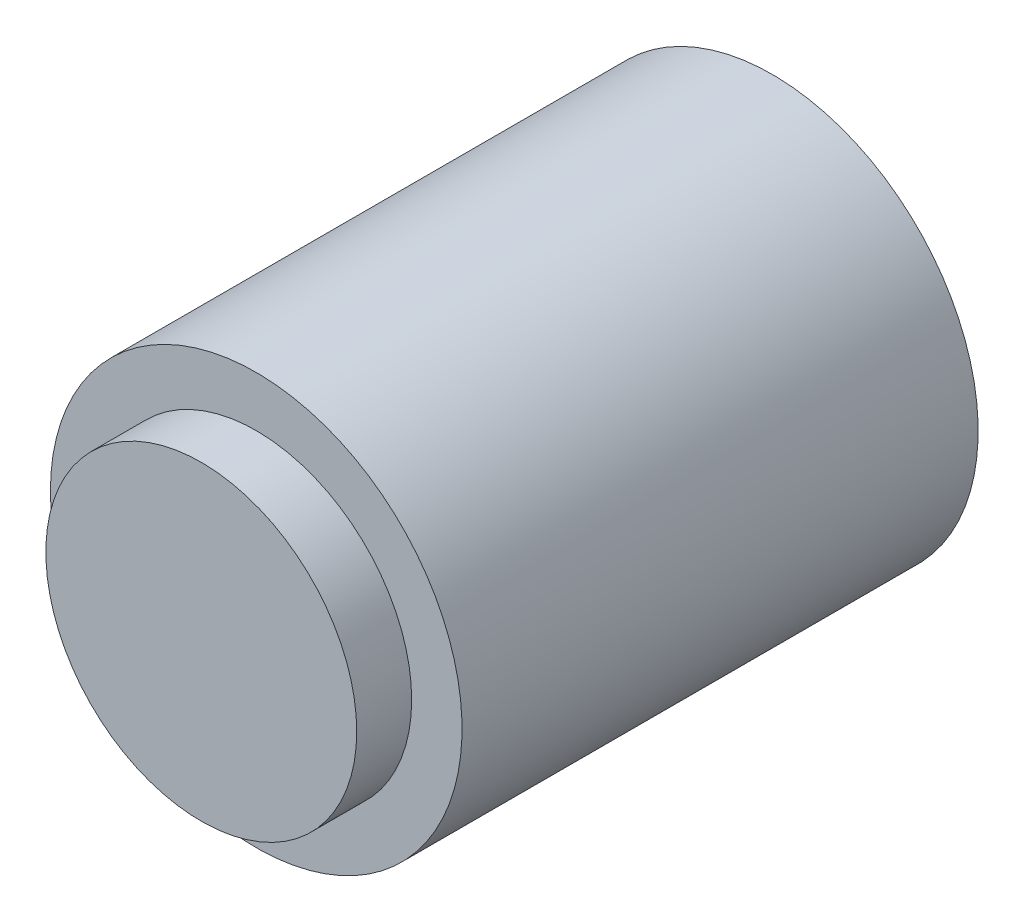
ISO-10303-21;
HEADER;
FILE_DESCRIPTION(('STEP AP214'),'2;1');
FILE_NAME('part.step','',(''),(''),'','','');
FILE_SCHEMA(('AUTOMOTIVE_DESIGN { 1 0 10303 214 1 1 1 1 }'));
ENDSEC;
DATA;
#1=APPLICATION_CONTEXT('core data for automotive mechanical design processes');
#2=APPLICATION_PROTOCOL_DEFINITION('international standard','automotive_design',2000,#1);
#3=PRODUCT_CONTEXT('',#1,'mechanical');
#4=PRODUCT('Part','Part','',(#3));
#5=PRODUCT_RELATED_PRODUCT_CATEGORY('part','',(#4));
#6=PRODUCT_DEFINITION_FORMATION('','',#4);
#7=PRODUCT_DEFINITION_CONTEXT('part definition',#1,'design');
#8=PRODUCT_DEFINITION('design','',#6,#7);
#9=PRODUCT_DEFINITION_SHAPE('','',#8);
#10=(LENGTH_UNIT() NAMED_UNIT(*) SI_UNIT(.MILLI.,.METRE.));
#11=(NAMED_UNIT(*) PLANE_ANGLE_UNIT() SI_UNIT($,.RADIAN.));
#12=(NAMED_UNIT(*) SI_UNIT($,.STERADIAN.) SOLID_ANGLE_UNIT());
#13=UNCERTAINTY_MEASURE_WITH_UNIT(LENGTH_MEASURE(1.E-05),#10,'distance_accuracy_value','');
#14=(GEOMETRIC_REPRESENTATION_CONTEXT(3) GLOBAL_UNCERTAINTY_ASSIGNED_CONTEXT((#13)) GLOBAL_UNIT_ASSIGNED_CONTEXT((#10,
#11,#12)) REPRESENTATION_CONTEXT('',''));
#15=CARTESIAN_POINT('',(0.,0.,0.));
#16=DIRECTION('',(0.,0.,1.));
#17=DIRECTION('',(1.,0.,0.));
#18=AXIS2_PLACEMENT_3D('',#15,#16,#17);
#19=CARTESIAN_POINT('',(0.,0.,42.));
#20=DIRECTION('',(0.,0.,-1.));
#21=DIRECTION('',(-1.,0.,0.));
#22=AXIS2_PLACEMENT_3D('',#19,#20,#21);
#23=CYLINDRICAL_SURFACE('',#22,16.75);
#24=CARTESIAN_POINT('',(0.,0.,42.));
#25=DIRECTION('',(0.,0.,1.));
#26=DIRECTION('',(1.,0.,0.));
#27=AXIS2_PLACEMENT_3D('',#24,#25,#26);
#28=CIRCLE('',#27,16.75);
#29=CARTESIAN_POINT('',(-16.75,0.,42.));
#30=VERTEX_POINT('',#29);
#31=EDGE_CURVE('E45',#30,#30,#28,.T.);
#32=CARTESIAN_POINT('',(0.,0.,0.));
#33=DIRECTION('',(0.,0.,1.));
#34=DIRECTION('',(1.,0.,0.));
#35=AXIS2_PLACEMENT_3D('',#32,#33,#34);
#36=CIRCLE('',#35,16.75);
#37=CARTESIAN_POINT('',(-16.75,0.,0.));
#38=VERTEX_POINT('',#37);
#39=EDGE_CURVE('E40',#38,#38,#36,.T.);
#40=CARTESIAN_POINT('',(-16.75,0.,42.));
#41=CARTESIAN_POINT('',(-16.75,0.,41.5625));
#42=CARTESIAN_POINT('',(-16.75,0.,41.125));
#43=CARTESIAN_POINT('',(-16.75,0.,40.25));
#44=CARTESIAN_POINT('',(-16.75,0.,39.8125));
#45=CARTESIAN_POINT('',(-16.75,0.,38.9375));
#46=CARTESIAN_POINT('',(-16.75,0.,38.5));
#47=CARTESIAN_POINT('',(-16.75,0.,37.625));
#48=CARTESIAN_POINT('',(-16.75,0.,37.1875));
#49=CARTESIAN_POINT('',(-16.75,0.,36.3125));
#50=CARTESIAN_POINT('',(-16.75,0.,35.875));
#51=CARTESIAN_POINT('',(-16.75,0.,35.));
#52=CARTESIAN_POINT('',(-16.75,0.,34.5625));
#53=CARTESIAN_POINT('',(-16.75,0.,33.6875));
#54=CARTESIAN_POINT('',(-16.75,0.,33.25));
#55=CARTESIAN_POINT('',(-16.75,0.,32.375));
#56=CARTESIAN_POINT('',(-16.75,0.,31.9375));
#57=CARTESIAN_POINT('',(-16.75,0.,31.0625));
#58=CARTESIAN_POINT('',(-16.75,0.,30.625));
#59=CARTESIAN_POINT('',(-16.75,0.,29.75));
#60=CARTESIAN_POINT('',(-16.75,0.,29.3125));
#61=CARTESIAN_POINT('',(-16.75,0.,28.4375));
#62=CARTESIAN_POINT('',(-16.75,0.,28.));
#63=CARTESIAN_POINT('',(-16.75,0.,27.125));
#64=CARTESIAN_POINT('',(-16.75,0.,26.6875));
#65=CARTESIAN_POINT('',(-16.75,0.,25.8125));
#66=CARTESIAN_POINT('',(-16.75,0.,25.375));
#67=CARTESIAN_POINT('',(-16.75,0.,24.5));
#68=CARTESIAN_POINT('',(-16.75,0.,24.0625));
#69=CARTESIAN_POINT('',(-16.75,0.,23.1875));
#70=CARTESIAN_POINT('',(-16.75,0.,22.75));
#71=CARTESIAN_POINT('',(-16.75,0.,21.875));
#72=CARTESIAN_POINT('',(-16.75,0.,21.4375));
#73=CARTESIAN_POINT('',(-16.75,0.,20.5625));
#74=CARTESIAN_POINT('',(-16.75,0.,20.125));
#75=CARTESIAN_POINT('',(-16.75,0.,19.25));
#76=CARTESIAN_POINT('',(-16.75,0.,18.8125));
#77=CARTESIAN_POINT('',(-16.75,0.,17.9375));
#78=CARTESIAN_POINT('',(-16.75,0.,17.5));
#79=CARTESIAN_POINT('',(-16.75,0.,16.625));
#80=CARTESIAN_POINT('',(-16.75,0.,16.1875));
#81=CARTESIAN_POINT('',(-16.75,0.,15.3125));
#82=CARTESIAN_POINT('',(-16.75,0.,14.875));
#83=CARTESIAN_POINT('',(-16.75,0.,14.));
#84=CARTESIAN_POINT('',(-16.75,0.,13.5625));
#85=CARTESIAN_POINT('',(-16.75,0.,12.6875));
#86=CARTESIAN_POINT('',(-16.75,0.,12.25));
#87=CARTESIAN_POINT('',(-16.75,0.,11.375));
#88=CARTESIAN_POINT('',(-16.75,0.,10.9375));
#89=CARTESIAN_POINT('',(-16.75,0.,10.0625));
#90=CARTESIAN_POINT('',(-16.75,0.,9.625));
#91=CARTESIAN_POINT('',(-16.75,0.,8.75));
#92=CARTESIAN_POINT('',(-16.75,0.,8.3125));
#93=CARTESIAN_POINT('',(-16.75,0.,7.4375));
#94=CARTESIAN_POINT('',(-16.75,0.,7.));
#95=CARTESIAN_POINT('',(-16.75,0.,6.125));
#96=CARTESIAN_POINT('',(-16.75,0.,5.6875));
#97=CARTESIAN_POINT('',(-16.75,0.,4.8125));
#98=CARTESIAN_POINT('',(-16.75,0.,4.375));
#99=CARTESIAN_POINT('',(-16.75,0.,3.5));
#100=CARTESIAN_POINT('',(-16.75,0.,3.0625));
#101=CARTESIAN_POINT('',(-16.75,0.,2.1875));
#102=CARTESIAN_POINT('',(-16.75,0.,1.75));
#103=CARTESIAN_POINT('',(-16.75,0.,0.875000000000001));
#104=CARTESIAN_POINT('',(-16.75,0.,0.4375));
#105=CARTESIAN_POINT('',(-16.75,0.,0.));
#106=B_SPLINE_CURVE_WITH_KNOTS('',3,(#40,#41,#42,#43,#44,#45,#46,#47,#48,#49,#50,#51,#52,#53,
#54,#55,#56,#57,#58,#59,#60,#61,#62,#63,#64,#65,#66,#67,#68,#69,#70,#71,#72,#73,#74,#75,#76,#77,
#78,#79,#80,#81,#82,#83,#84,#85,#86,#87,#88,#89,#90,#91,#92,#93,#94,#95,#96,#97,#98,#99,#100,
#101,#102,#103,#104,#105),.UNSPECIFIED.,.F.,.F.,(4,2,2,2,2,2,2,2,2,2,2,2,2,2,2,2,2,2,2,2,2,2,2,
2,2,2,2,2,2,2,2,2,4),(0.,1.3125,2.625,3.9375,5.25,6.56250000000001,7.875,9.1875,10.5,11.8125,
13.125,14.4375,15.75,17.0625,18.375,19.6875,21.,22.3125,23.625,24.9375,26.25,27.5625,28.875,
30.1875,31.5,32.8125,34.125,35.4375,36.75,38.0625,39.375,40.6875,42.),.UNSPECIFIED.);
#107=EDGE_CURVE('BSEAM37',#30,#38,#106,.T.);
#108=ORIENTED_EDGE('',*,*,#31,.F.);
#109=ORIENTED_EDGE('',*,*,#39,.T.);
#110=ORIENTED_EDGE('',*,*,#107,.T.);
#111=ORIENTED_EDGE('',*,*,#107,.F.);
#112=EDGE_LOOP('',(#108,#110,#109,#111));
#113=FACE_BOUND('',#112,.T.);
#114=ADVANCED_FACE('F37',(#113),#23,.T.);
#115=CARTESIAN_POINT('',(0.,0.,42.));
#116=DIRECTION('',(0.,0.,1.));
#117=DIRECTION('',(1.,0.,0.));
#118=AXIS2_PLACEMENT_3D('',#115,#116,#117);
#119=PLANE('',#118);
#120=CARTESIAN_POINT('',(0.,0.,42.));
#121=DIRECTION('',(0.,0.,1.));
#122=DIRECTION('',(1.,0.,0.));
#123=AXIS2_PLACEMENT_3D('',#120,#121,#122);
#124=CIRCLE('',#123,12.65);
#125=CARTESIAN_POINT('',(12.65,0.,42.));
#126=VERTEX_POINT('',#125);
#127=EDGE_CURVE('E10',#126,#126,#124,.T.);
#128=ORIENTED_EDGE('',*,*,#127,.F.);
#129=EDGE_LOOP('',(#128));
#130=FACE_BOUND('',#129,.T.);
#131=ORIENTED_EDGE('',*,*,#31,.T.);
#132=EDGE_LOOP('',(#131));
#133=FACE_BOUND('',#132,.T.);
#134=ADVANCED_FACE('F78',(#130,#133),#119,.T.);
#135=CARTESIAN_POINT('',(0.,0.,0.));
#136=DIRECTION('',(0.,0.,1.));
#137=DIRECTION('',(1.,0.,0.));
#138=AXIS2_PLACEMENT_3D('',#135,#136,#137);
#139=PLANE('',#138);
#140=CARTESIAN_POINT('',(0.,0.,0.));
#141=DIRECTION('',(0.,0.,-1.));
#142=DIRECTION('',(-1.,0.,0.));
#143=AXIS2_PLACEMENT_3D('',#140,#141,#142);
#144=CIRCLE('',#143,15.5);
#145=CARTESIAN_POINT('',(-15.5,0.,0.));
#146=VERTEX_POINT('',#145);
#147=EDGE_CURVE('E57',#146,#146,#144,.T.);
#148=ORIENTED_EDGE('',*,*,#147,.F.);
#149=EDGE_LOOP('',(#148));
#150=FACE_BOUND('',#149,.T.);
#151=ORIENTED_EDGE('',*,*,#39,.F.);
#152=EDGE_LOOP('',(#151));
#153=FACE_BOUND('',#152,.T.);
#154=ADVANCED_FACE('F74',(#150,#153),#139,.F.);
#155=CARTESIAN_POINT('',(0.,0.,46.47));
#156=DIRECTION('',(0.,0.,-1.));
#157=DIRECTION('',(-1.,0.,0.));
#158=AXIS2_PLACEMENT_3D('',#155,#156,#157);
#159=CYLINDRICAL_SURFACE('',#158,12.65);
#160=CARTESIAN_POINT('',(0.,0.,46.47));
#161=DIRECTION('',(0.,0.,1.));
#162=DIRECTION('',(1.,0.,0.));
#163=AXIS2_PLACEMENT_3D('',#160,#161,#162);
#164=CIRCLE('',#163,12.65);
#165=CARTESIAN_POINT('',(12.65,0.,46.47));
#166=VERTEX_POINT('',#165);
#167=EDGE_CURVE('E52',#166,#166,#164,.T.);
#168=ORIENTED_EDGE('',*,*,#167,.F.);
#169=EDGE_LOOP('',(#168));
#170=FACE_BOUND('',#169,.T.);
#171=ORIENTED_EDGE('',*,*,#127,.T.);
#172=EDGE_LOOP('',(#171));
#173=FACE_BOUND('',#172,.T.);
#174=ADVANCED_FACE('F77',(#170,#173),#159,.T.);
#175=CARTESIAN_POINT('',(0.,0.,46.47));
#176=DIRECTION('',(0.,0.,1.));
#177=DIRECTION('',(1.,0.,0.));
#178=AXIS2_PLACEMENT_3D('',#175,#176,#177);
#179=PLANE('',#178);
#180=ORIENTED_EDGE('',*,*,#167,.T.);
#181=EDGE_LOOP('',(#180));
#182=FACE_BOUND('',#181,.T.);
#183=ADVANCED_FACE('F70',(#182),#179,.T.);
#184=CARTESIAN_POINT('',(0.,0.,4.7));
#185=DIRECTION('',(0.,0.,-1.));
#186=DIRECTION('',(-1.,0.,0.));
#187=AXIS2_PLACEMENT_3D('',#184,#185,#186);
#188=CYLINDRICAL_SURFACE('',#187,15.5);
#189=CARTESIAN_POINT('',(0.,0.,4.7));
#190=DIRECTION('',(0.,0.,-1.));
#191=DIRECTION('',(-1.,0.,0.));
#192=AXIS2_PLACEMENT_3D('',#189,#190,#191);
#193=CIRCLE('',#192,15.5);
#194=CARTESIAN_POINT('',(-15.5,0.,4.7));
#195=VERTEX_POINT('',#194);
#196=EDGE_CURVE('E56',#195,#195,#193,.T.);
#197=ORIENTED_EDGE('',*,*,#196,.F.);
#198=EDGE_LOOP('',(#197));
#199=FACE_BOUND('',#198,.T.);
#200=ORIENTED_EDGE('',*,*,#147,.T.);
#201=EDGE_LOOP('',(#200));
#202=FACE_BOUND('',#201,.T.);
#203=ADVANCED_FACE('F67',(#199,#202),#188,.F.);
#204=CARTESIAN_POINT('',(0.,0.,4.7));
#205=DIRECTION('',(0.,0.,-1.));
#206=DIRECTION('',(-1.,0.,0.));
#207=AXIS2_PLACEMENT_3D('',#204,#205,#206);
#208=PLANE('',#207);
#209=ORIENTED_EDGE('',*,*,#196,.T.);
#210=EDGE_LOOP('',(#209));
#211=FACE_BOUND('',#210,.T.);
#212=ADVANCED_FACE('F65',(#211),#208,.T.);
#213=CLOSED_SHELL('',(#114,#134,#154,#174,#183,#203,#212));
#214=MANIFOLD_SOLID_BREP('B2',#213);
#215=ADVANCED_BREP_SHAPE_REPRESENTATION('',(#18,#214),#14);
#216=SHAPE_DEFINITION_REPRESENTATION(#9,#215);
ENDSEC;
END-ISO-10303-21;
